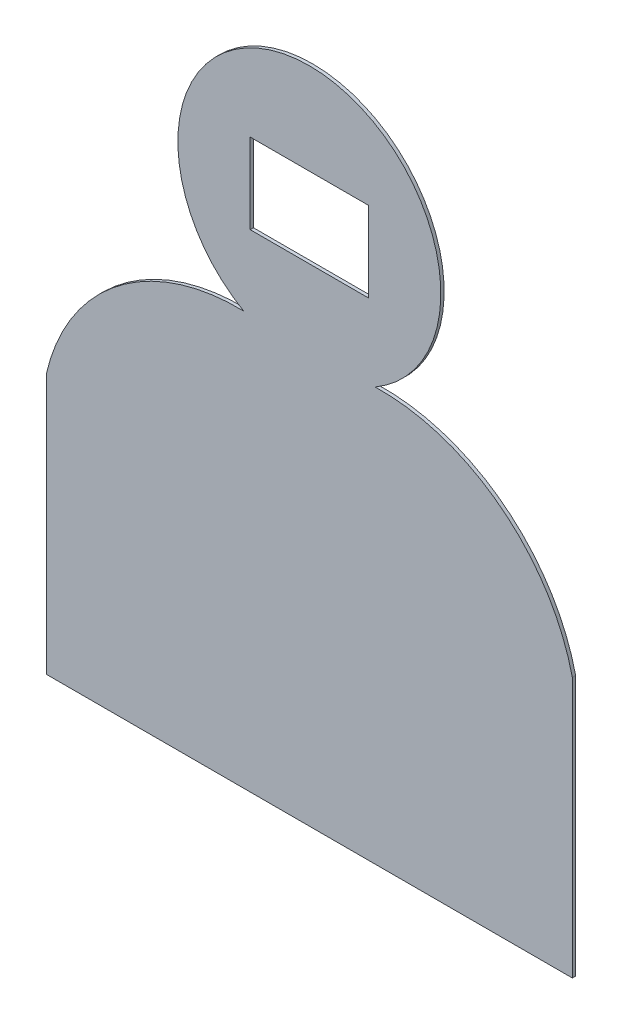
ISO-10303-21;
HEADER;
FILE_DESCRIPTION(('STEP AP214'),'2;1');
FILE_NAME('part.step','',(''),(''),'','','');
FILE_SCHEMA(('AUTOMOTIVE_DESIGN { 1 0 10303 214 1 1 1 1 }'));
ENDSEC;
DATA;
#1=APPLICATION_CONTEXT('core data for automotive mechanical design processes');
#2=APPLICATION_PROTOCOL_DEFINITION('international standard','automotive_design',2000,#1);
#3=PRODUCT_CONTEXT('',#1,'mechanical');
#4=PRODUCT('Part','Part','',(#3));
#5=PRODUCT_RELATED_PRODUCT_CATEGORY('part','',(#4));
#6=PRODUCT_DEFINITION_FORMATION('','',#4);
#7=PRODUCT_DEFINITION_CONTEXT('part definition',#1,'design');
#8=PRODUCT_DEFINITION('design','',#6,#7);
#9=PRODUCT_DEFINITION_SHAPE('','',#8);
#10=(LENGTH_UNIT() NAMED_UNIT(*) SI_UNIT(.MILLI.,.METRE.));
#11=(NAMED_UNIT(*) PLANE_ANGLE_UNIT() SI_UNIT($,.RADIAN.));
#12=(NAMED_UNIT(*) SI_UNIT($,.STERADIAN.) SOLID_ANGLE_UNIT());
#13=UNCERTAINTY_MEASURE_WITH_UNIT(LENGTH_MEASURE(1.E-05),#10,'distance_accuracy_value','');
#14=(GEOMETRIC_REPRESENTATION_CONTEXT(3) GLOBAL_UNCERTAINTY_ASSIGNED_CONTEXT((#13)) GLOBAL_UNIT_ASSIGNED_CONTEXT((#10,
#11,#12)) REPRESENTATION_CONTEXT('',''));
#15=CARTESIAN_POINT('',(0.,0.,0.));
#16=DIRECTION('',(0.,0.,1.));
#17=DIRECTION('',(1.,0.,0.));
#18=AXIS2_PLACEMENT_3D('',#15,#16,#17);
#19=CARTESIAN_POINT('',(0.,803.705080756888,5.));
#20=DIRECTION('',(0.,1.,0.));
#21=DIRECTION('',(0.,0.,1.));
#22=AXIS2_PLACEMENT_3D('',#19,#20,#21);
#23=PLANE('',#22);
#24=DIRECTION('',(1.,0.,0.));
#25=VECTOR('',#24,1.);
#26=CARTESIAN_POINT('',(0.,803.705080756888,0.));
#27=LINE('',#26,#25);
#28=CARTESIAN_POINT('',(-137.59158081882,803.705080756888,0.));
#29=VERTEX_POINT('',#28);
#30=CARTESIAN_POINT('',(42.4084191811797,803.705080756888,0.));
#31=VERTEX_POINT('',#30);
#32=EDGE_CURVE('E159',#29,#31,#27,.T.);
#33=ORIENTED_EDGE('',*,*,#32,.T.);
#34=DIRECTION('',(0.,0.,-1.));
#35=VECTOR('',#34,1.);
#36=CARTESIAN_POINT('',(42.4084191811797,803.705080756888,5.));
#37=LINE('',#36,#35);
#38=CARTESIAN_POINT('',(42.4084191811797,803.705080756888,5.));
#39=VERTEX_POINT('',#38);
#40=EDGE_CURVE('E11',#39,#31,#37,.T.);
#41=ORIENTED_EDGE('',*,*,#40,.F.);
#42=DIRECTION('',(1.,0.,0.));
#43=VECTOR('',#42,1.);
#44=CARTESIAN_POINT('',(0.,803.705080756888,5.));
#45=LINE('',#44,#43);
#46=CARTESIAN_POINT('',(-137.59158081882,803.705080756888,5.));
#47=VERTEX_POINT('',#46);
#48=EDGE_CURVE('E126',#47,#39,#45,.T.);
#49=ORIENTED_EDGE('',*,*,#48,.F.);
#50=DIRECTION('',(0.,0.,-1.));
#51=VECTOR('',#50,1.);
#52=CARTESIAN_POINT('',(-137.59158081882,803.705080756888,5.));
#53=LINE('',#52,#51);
#54=EDGE_CURVE('E54',#47,#29,#53,.T.);
#55=ORIENTED_EDGE('',*,*,#54,.T.);
#56=EDGE_LOOP('',(#33,#41,#49,#55));
#57=FACE_BOUND('',#56,.T.);
#58=ADVANCED_FACE('F35',(#57),#23,.F.);
#59=CARTESIAN_POINT('',(42.4084191811816,1.03717241124735E-13,5.));
#60=DIRECTION('',(1.,0.,0.));
#61=DIRECTION('',(0.,1.,0.));
#62=AXIS2_PLACEMENT_3D('',#59,#60,#61);
#63=PLANE('',#62);
#64=DIRECTION('',(0.,-1.,0.));
#65=VECTOR('',#64,1.);
#66=CARTESIAN_POINT('',(42.4084191811816,1.03717241124735E-13,0.));
#67=LINE('',#66,#65);
#68=CARTESIAN_POINT('',(42.40841918118,681.705080756888,0.));
#69=VERTEX_POINT('',#68);
#70=EDGE_CURVE('E132',#31,#69,#67,.T.);
#71=ORIENTED_EDGE('',*,*,#70,.T.);
#72=DIRECTION('',(0.,0.,-1.));
#73=VECTOR('',#72,1.);
#74=CARTESIAN_POINT('',(42.40841918118,681.705080756888,5.));
#75=LINE('',#74,#73);
#76=CARTESIAN_POINT('',(42.40841918118,681.705080756888,5.));
#77=VERTEX_POINT('',#76);
#78=EDGE_CURVE('E45',#77,#69,#75,.T.);
#79=ORIENTED_EDGE('',*,*,#78,.F.);
#80=DIRECTION('',(0.,-1.,0.));
#81=VECTOR('',#80,1.);
#82=CARTESIAN_POINT('',(42.4084191811816,1.03717241124735E-13,5.));
#83=LINE('',#82,#81);
#84=EDGE_CURVE('E120',#39,#77,#83,.T.);
#85=ORIENTED_EDGE('',*,*,#84,.F.);
#86=ORIENTED_EDGE('',*,*,#40,.T.);
#87=EDGE_LOOP('',(#71,#79,#85,#86));
#88=FACE_BOUND('',#87,.T.);
#89=ADVANCED_FACE('F131',(#88),#63,.F.);
#90=CARTESIAN_POINT('',(0.,681.705080756888,5.));
#91=DIRECTION('',(0.,1.,0.));
#92=DIRECTION('',(0.,0.,1.));
#93=AXIS2_PLACEMENT_3D('',#90,#91,#92);
#94=PLANE('',#93);
#95=DIRECTION('',(1.,0.,0.));
#96=VECTOR('',#95,1.);
#97=CARTESIAN_POINT('',(0.,681.705080756888,0.));
#98=LINE('',#97,#96);
#99=CARTESIAN_POINT('',(-137.591580818821,681.705080756888,0.));
#100=VERTEX_POINT('',#99);
#101=EDGE_CURVE('E162',#100,#69,#98,.T.);
#102=ORIENTED_EDGE('',*,*,#101,.F.);
#103=DIRECTION('',(0.,0.,-1.));
#104=VECTOR('',#103,1.);
#105=CARTESIAN_POINT('',(-137.591580818821,681.705080756888,5.));
#106=LINE('',#105,#104);
#107=CARTESIAN_POINT('',(-137.591580818821,681.705080756888,5.));
#108=VERTEX_POINT('',#107);
#109=EDGE_CURVE('E86',#108,#100,#106,.T.);
#110=ORIENTED_EDGE('',*,*,#109,.F.);
#111=DIRECTION('',(1.,0.,0.));
#112=VECTOR('',#111,1.);
#113=CARTESIAN_POINT('',(0.,681.705080756888,5.));
#114=LINE('',#113,#112);
#115=EDGE_CURVE('E125',#108,#77,#114,.T.);
#116=ORIENTED_EDGE('',*,*,#115,.T.);
#117=ORIENTED_EDGE('',*,*,#78,.T.);
#118=EDGE_LOOP('',(#102,#110,#116,#117));
#119=FACE_BOUND('',#118,.T.);
#120=ADVANCED_FACE('F136',(#119),#94,.T.);
#121=CARTESIAN_POINT('',(60.0878997477041,269.598306810002,5.));
#122=DIRECTION('',(0.,0.,-1.));
#123=DIRECTION('',(-1.,0.,0.));
#124=AXIS2_PLACEMENT_3D('',#121,#122,#123);
#125=CYLINDRICAL_SURFACE('',#124,300.);
#126=CARTESIAN_POINT('',(60.0878997477041,269.598306810002,0.));
#127=DIRECTION('',(0.,0.,1.));
#128=DIRECTION('',(1.,0.,0.));
#129=AXIS2_PLACEMENT_3D('',#126,#127,#128);
#130=CIRCLE('',#129,300.);
#131=CARTESIAN_POINT('',(52.4084191811804,569.500000000001,0.));
#132=VERTEX_POINT('',#131);
#133=CARTESIAN_POINT('',(352.408419181181,337.042460879443,0.));
#134=VERTEX_POINT('',#133);
#135=EDGE_CURVE('E143',#132,#134,#130,.F.);
#136=ORIENTED_EDGE('',*,*,#135,.F.);
#137=DIRECTION('',(0.,0.,-1.));
#138=VECTOR('',#137,1.);
#139=CARTESIAN_POINT('',(52.4084191811804,569.500000000001,5.));
#140=LINE('',#139,#138);
#141=CARTESIAN_POINT('',(52.4084191811804,569.500000000001,5.));
#142=VERTEX_POINT('',#141);
#143=EDGE_CURVE('E39',#142,#132,#140,.T.);
#144=ORIENTED_EDGE('',*,*,#143,.F.);
#145=CARTESIAN_POINT('',(60.0878997477041,269.598306810002,5.));
#146=DIRECTION('',(0.,0.,1.));
#147=DIRECTION('',(1.,0.,0.));
#148=AXIS2_PLACEMENT_3D('',#145,#146,#147);
#149=CIRCLE('',#148,300.);
#150=CARTESIAN_POINT('',(352.408419181181,337.042460879443,5.));
#151=VERTEX_POINT('',#150);
#152=EDGE_CURVE('E167',#142,#151,#149,.F.);
#153=ORIENTED_EDGE('',*,*,#152,.T.);
#154=DIRECTION('',(0.,0.,-1.));
#155=VECTOR('',#154,1.);
#156=CARTESIAN_POINT('',(352.408419181181,337.042460879443,5.));
#157=LINE('',#156,#155);
#158=EDGE_CURVE('E139',#151,#134,#157,.T.);
#159=ORIENTED_EDGE('',*,*,#158,.T.);
#160=EDGE_LOOP('',(#136,#144,#153,#159));
#161=FACE_BOUND('',#160,.T.);
#162=ADVANCED_FACE('F37',(#161),#125,.T.);
#163=CARTESIAN_POINT('',(-47.5915808188204,742.705080756888,5.));
#164=DIRECTION('',(0.,0.,-1.));
#165=DIRECTION('',(-1.,0.,0.));
#166=AXIS2_PLACEMENT_3D('',#163,#164,#165);
#167=CYLINDRICAL_SURFACE('',#166,200.);
#168=CARTESIAN_POINT('',(-47.5915808188204,742.705080756888,0.));
#169=DIRECTION('',(0.,0.,1.));
#170=DIRECTION('',(1.,0.,0.));
#171=AXIS2_PLACEMENT_3D('',#168,#169,#170);
#172=CIRCLE('',#171,200.);
#173=CARTESIAN_POINT('',(-147.591580818819,569.5,0.));
#174=VERTEX_POINT('',#173);
#175=EDGE_CURVE('E146',#132,#174,#172,.T.);
#176=ORIENTED_EDGE('',*,*,#175,.T.);
#177=DIRECTION('',(0.,0.,-1.));
#178=VECTOR('',#177,1.);
#179=CARTESIAN_POINT('',(-147.591580818819,569.5,5.));
#180=LINE('',#179,#178);
#181=CARTESIAN_POINT('',(-147.591580818819,569.5,5.));
#182=VERTEX_POINT('',#181);
#183=EDGE_CURVE('E177',#182,#174,#180,.T.);
#184=ORIENTED_EDGE('',*,*,#183,.F.);
#185=CARTESIAN_POINT('',(-47.5915808188204,742.705080756888,5.));
#186=DIRECTION('',(0.,0.,1.));
#187=DIRECTION('',(1.,0.,0.));
#188=AXIS2_PLACEMENT_3D('',#185,#186,#187);
#189=CIRCLE('',#188,200.);
#190=EDGE_CURVE('E186',#142,#182,#189,.T.);
#191=ORIENTED_EDGE('',*,*,#190,.F.);
#192=ORIENTED_EDGE('',*,*,#143,.T.);
#193=EDGE_LOOP('',(#176,#184,#191,#192));
#194=FACE_BOUND('',#193,.T.);
#195=ADVANCED_FACE('F185',(#194),#167,.T.);
#196=CARTESIAN_POINT('',(-155.271061385343,269.598306810001,5.));
#197=DIRECTION('',(0.,0.,-1.));
#198=DIRECTION('',(-1.,0.,0.));
#199=AXIS2_PLACEMENT_3D('',#196,#197,#198);
#200=CYLINDRICAL_SURFACE('',#199,300.);
#201=CARTESIAN_POINT('',(-155.271061385343,269.598306810001,0.));
#202=DIRECTION('',(0.,0.,1.));
#203=DIRECTION('',(1.,0.,0.));
#204=AXIS2_PLACEMENT_3D('',#201,#202,#203);
#205=CIRCLE('',#204,300.);
#206=CARTESIAN_POINT('',(-447.591580818819,337.042460879442,0.));
#207=VERTEX_POINT('',#206);
#208=EDGE_CURVE('E148',#174,#207,#205,.T.);
#209=ORIENTED_EDGE('',*,*,#208,.T.);
#210=DIRECTION('',(0.,0.,-1.));
#211=VECTOR('',#210,1.);
#212=CARTESIAN_POINT('',(-447.591580818819,337.042460879442,5.));
#213=LINE('',#212,#211);
#214=CARTESIAN_POINT('',(-447.591580818819,337.042460879442,5.));
#215=VERTEX_POINT('',#214);
#216=EDGE_CURVE('E175',#215,#207,#213,.T.);
#217=ORIENTED_EDGE('',*,*,#216,.F.);
#218=CARTESIAN_POINT('',(-155.271061385343,269.598306810001,5.));
#219=DIRECTION('',(0.,0.,1.));
#220=DIRECTION('',(1.,0.,0.));
#221=AXIS2_PLACEMENT_3D('',#218,#219,#220);
#222=CIRCLE('',#221,300.);
#223=EDGE_CURVE('E211',#182,#215,#222,.T.);
#224=ORIENTED_EDGE('',*,*,#223,.F.);
#225=ORIENTED_EDGE('',*,*,#183,.T.);
#226=EDGE_LOOP('',(#209,#217,#224,#225));
#227=FACE_BOUND('',#226,.T.);
#228=ADVANCED_FACE('F210',(#227),#200,.T.);
#229=CARTESIAN_POINT('',(-447.591580818819,0.,5.));
#230=DIRECTION('',(1.,0.,0.));
#231=DIRECTION('',(0.,0.,-1.));
#232=AXIS2_PLACEMENT_3D('',#229,#230,#231);
#233=PLANE('',#232);
#234=DIRECTION('',(0.,-1.,0.));
#235=VECTOR('',#234,1.);
#236=CARTESIAN_POINT('',(-447.591580818819,0.,0.));
#237=LINE('',#236,#235);
#238=CARTESIAN_POINT('',(-447.591580818819,-59.0824847963416,0.));
#239=VERTEX_POINT('',#238);
#240=EDGE_CURVE('E150',#207,#239,#237,.T.);
#241=ORIENTED_EDGE('',*,*,#240,.T.);
#242=DIRECTION('',(0.,0.,-1.));
#243=VECTOR('',#242,1.);
#244=CARTESIAN_POINT('',(-447.591580818819,-59.0824847963416,5.));
#245=LINE('',#244,#243);
#246=CARTESIAN_POINT('',(-447.591580818819,-59.0824847963416,5.));
#247=VERTEX_POINT('',#246);
#248=EDGE_CURVE('E173',#247,#239,#245,.T.);
#249=ORIENTED_EDGE('',*,*,#248,.F.);
#250=DIRECTION('',(0.,-1.,0.));
#251=VECTOR('',#250,1.);
#252=CARTESIAN_POINT('',(-447.591580818819,0.,5.));
#253=LINE('',#252,#251);
#254=EDGE_CURVE('E209',#215,#247,#253,.T.);
#255=ORIENTED_EDGE('',*,*,#254,.F.);
#256=ORIENTED_EDGE('',*,*,#216,.T.);
#257=EDGE_LOOP('',(#241,#249,#255,#256));
#258=FACE_BOUND('',#257,.T.);
#259=ADVANCED_FACE('F207',(#258),#233,.F.);
#260=CARTESIAN_POINT('',(0.,-59.0824847963415,5.));
#261=DIRECTION('',(0.,-1.,0.));
#262=DIRECTION('',(1.,0.,0.));
#263=AXIS2_PLACEMENT_3D('',#260,#261,#262);
#264=PLANE('',#263);
#265=DIRECTION('',(-1.,0.,0.));
#266=VECTOR('',#265,1.);
#267=CARTESIAN_POINT('',(0.,-59.0824847963415,0.));
#268=LINE('',#267,#266);
#269=CARTESIAN_POINT('',(352.408419181181,-59.0824847963413,0.));
#270=VERTEX_POINT('',#269);
#271=EDGE_CURVE('E153',#270,#239,#268,.T.);
#272=ORIENTED_EDGE('',*,*,#271,.F.);
#273=DIRECTION('',(0.,0.,-1.));
#274=VECTOR('',#273,1.);
#275=CARTESIAN_POINT('',(352.408419181181,-59.0824847963413,5.));
#276=LINE('',#275,#274);
#277=CARTESIAN_POINT('',(352.408419181181,-59.0824847963413,5.));
#278=VERTEX_POINT('',#277);
#279=EDGE_CURVE('E171',#278,#270,#276,.T.);
#280=ORIENTED_EDGE('',*,*,#279,.F.);
#281=DIRECTION('',(-1.,0.,0.));
#282=VECTOR('',#281,1.);
#283=CARTESIAN_POINT('',(0.,-59.0824847963415,5.));
#284=LINE('',#283,#282);
#285=EDGE_CURVE('E204',#278,#247,#284,.T.);
#286=ORIENTED_EDGE('',*,*,#285,.T.);
#287=ORIENTED_EDGE('',*,*,#248,.T.);
#288=EDGE_LOOP('',(#272,#280,#286,#287));
#289=FACE_BOUND('',#288,.T.);
#290=ADVANCED_FACE('F200',(#289),#264,.T.);
#291=CARTESIAN_POINT('',(352.408419181181,0.,5.));
#292=DIRECTION('',(1.,0.,0.));
#293=DIRECTION('',(0.,1.,0.));
#294=AXIS2_PLACEMENT_3D('',#291,#292,#293);
#295=PLANE('',#294);
#296=DIRECTION('',(0.,-1.,0.));
#297=VECTOR('',#296,1.);
#298=CARTESIAN_POINT('',(352.408419181181,0.,0.));
#299=LINE('',#298,#297);
#300=EDGE_CURVE('E156',#134,#270,#299,.T.);
#301=ORIENTED_EDGE('',*,*,#300,.F.);
#302=ORIENTED_EDGE('',*,*,#158,.F.);
#303=DIRECTION('',(0.,-1.,0.));
#304=VECTOR('',#303,1.);
#305=CARTESIAN_POINT('',(352.408419181181,0.,5.));
#306=LINE('',#305,#304);
#307=EDGE_CURVE('E197',#151,#278,#306,.T.);
#308=ORIENTED_EDGE('',*,*,#307,.T.);
#309=ORIENTED_EDGE('',*,*,#279,.T.);
#310=EDGE_LOOP('',(#301,#302,#308,#309));
#311=FACE_BOUND('',#310,.T.);
#312=ADVANCED_FACE('F196',(#311),#295,.T.);
#313=CARTESIAN_POINT('',(-137.591580818823,4.69541007232471E-13,5.));
#314=DIRECTION('',(1.,0.,0.));
#315=DIRECTION('',(0.,1.,0.));
#316=AXIS2_PLACEMENT_3D('',#313,#314,#315);
#317=PLANE('',#316);
#318=DIRECTION('',(0.,-1.,0.));
#319=VECTOR('',#318,1.);
#320=CARTESIAN_POINT('',(-137.591580818823,4.69541007232471E-13,0.));
#321=LINE('',#320,#319);
#322=EDGE_CURVE('E164',#29,#100,#321,.T.);
#323=ORIENTED_EDGE('',*,*,#322,.F.);
#324=ORIENTED_EDGE('',*,*,#54,.F.);
#325=DIRECTION('',(0.,-1.,0.));
#326=VECTOR('',#325,1.);
#327=CARTESIAN_POINT('',(-137.591580818823,4.69541007232471E-13,5.));
#328=LINE('',#327,#326);
#329=EDGE_CURVE('E137',#47,#108,#328,.T.);
#330=ORIENTED_EDGE('',*,*,#329,.T.);
#331=ORIENTED_EDGE('',*,*,#109,.T.);
#332=EDGE_LOOP('',(#323,#324,#330,#331));
#333=FACE_BOUND('',#332,.T.);
#334=ADVANCED_FACE('F220',(#333),#317,.T.);
#335=CARTESIAN_POINT('',(0.,0.,5.));
#336=DIRECTION('',(0.,0.,1.));
#337=DIRECTION('',(1.,0.,0.));
#338=AXIS2_PLACEMENT_3D('',#335,#336,#337);
#339=PLANE('',#338);
#340=ORIENTED_EDGE('',*,*,#152,.F.);
#341=ORIENTED_EDGE('',*,*,#190,.T.);
#342=ORIENTED_EDGE('',*,*,#223,.T.);
#343=ORIENTED_EDGE('',*,*,#254,.T.);
#344=ORIENTED_EDGE('',*,*,#285,.F.);
#345=ORIENTED_EDGE('',*,*,#307,.F.);
#346=EDGE_LOOP('',(#340,#341,#342,#343,#344,#345));
#347=FACE_BOUND('',#346,.T.);
#348=ORIENTED_EDGE('',*,*,#48,.T.);
#349=ORIENTED_EDGE('',*,*,#84,.T.);
#350=ORIENTED_EDGE('',*,*,#115,.F.);
#351=ORIENTED_EDGE('',*,*,#329,.F.);
#352=EDGE_LOOP('',(#348,#349,#350,#351));
#353=FACE_BOUND('',#352,.T.);
#354=ADVANCED_FACE('F122',(#347,#353),#339,.T.);
#355=CARTESIAN_POINT('',(0.,0.,0.));
#356=DIRECTION('',(0.,0.,1.));
#357=DIRECTION('',(1.,0.,0.));
#358=AXIS2_PLACEMENT_3D('',#355,#356,#357);
#359=PLANE('',#358);
#360=ORIENTED_EDGE('',*,*,#135,.T.);
#361=ORIENTED_EDGE('',*,*,#300,.T.);
#362=ORIENTED_EDGE('',*,*,#271,.T.);
#363=ORIENTED_EDGE('',*,*,#240,.F.);
#364=ORIENTED_EDGE('',*,*,#208,.F.);
#365=ORIENTED_EDGE('',*,*,#175,.F.);
#366=EDGE_LOOP('',(#360,#361,#362,#363,#364,#365));
#367=FACE_BOUND('',#366,.T.);
#368=ORIENTED_EDGE('',*,*,#32,.F.);
#369=ORIENTED_EDGE('',*,*,#322,.T.);
#370=ORIENTED_EDGE('',*,*,#101,.T.);
#371=ORIENTED_EDGE('',*,*,#70,.F.);
#372=EDGE_LOOP('',(#368,#369,#370,#371));
#373=FACE_BOUND('',#372,.T.);
#374=ADVANCED_FACE('F189',(#367,#373),#359,.F.);
#375=CLOSED_SHELL('',(#58,#89,#120,#162,#195,#228,#259,#290,#312,#334,#354,#374));
#376=MANIFOLD_SOLID_BREP('B2',#375);
#377=ADVANCED_BREP_SHAPE_REPRESENTATION('',(#18,#376),#14);
#378=SHAPE_DEFINITION_REPRESENTATION(#9,#377);
ENDSEC;
END-ISO-10303-21;
